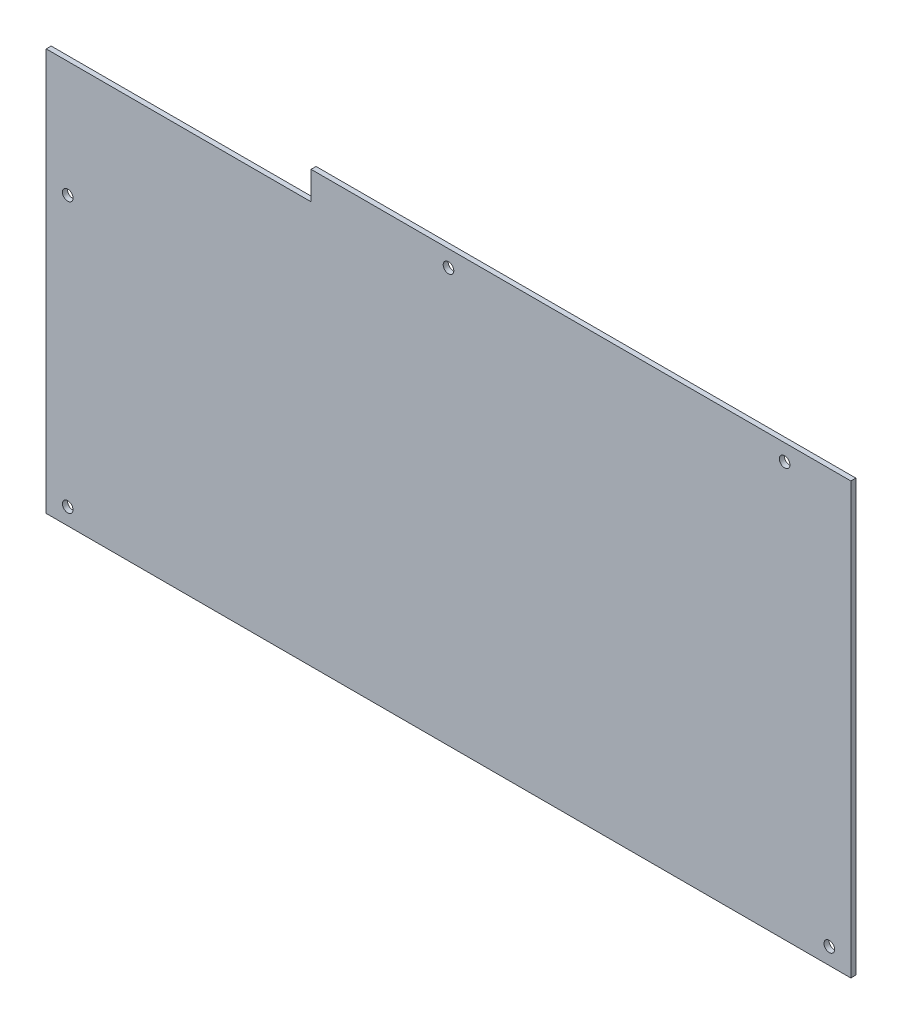
ISO-10303-21;
HEADER;
FILE_DESCRIPTION(('STEP AP214'),'2;1');
FILE_NAME('part.step','',(''),(''),'','','');
FILE_SCHEMA(('AUTOMOTIVE_DESIGN { 1 0 10303 214 1 1 1 1 }'));
ENDSEC;
DATA;
#1=APPLICATION_CONTEXT('core data for automotive mechanical design processes');
#2=APPLICATION_PROTOCOL_DEFINITION('international standard','automotive_design',2000,#1);
#3=PRODUCT_CONTEXT('',#1,'mechanical');
#4=PRODUCT('Part','Part','',(#3));
#5=PRODUCT_RELATED_PRODUCT_CATEGORY('part','',(#4));
#6=PRODUCT_DEFINITION_FORMATION('','',#4);
#7=PRODUCT_DEFINITION_CONTEXT('part definition',#1,'design');
#8=PRODUCT_DEFINITION('design','',#6,#7);
#9=PRODUCT_DEFINITION_SHAPE('','',#8);
#10=(LENGTH_UNIT() NAMED_UNIT(*) SI_UNIT(.MILLI.,.METRE.));
#11=(NAMED_UNIT(*) PLANE_ANGLE_UNIT() SI_UNIT($,.RADIAN.));
#12=(NAMED_UNIT(*) SI_UNIT($,.STERADIAN.) SOLID_ANGLE_UNIT());
#13=UNCERTAINTY_MEASURE_WITH_UNIT(LENGTH_MEASURE(1.E-05),#10,'distance_accuracy_value','');
#14=(GEOMETRIC_REPRESENTATION_CONTEXT(3) GLOBAL_UNCERTAINTY_ASSIGNED_CONTEXT((#13)) GLOBAL_UNIT_ASSIGNED_CONTEXT((#10,
#11,#12)) REPRESENTATION_CONTEXT('',''));
#15=CARTESIAN_POINT('',(0.,0.,0.));
#16=DIRECTION('',(0.,0.,1.));
#17=DIRECTION('',(1.,0.,0.));
#18=AXIS2_PLACEMENT_3D('',#15,#16,#17);
#19=CARTESIAN_POINT('',(-241.5,1.49999999999999,1.5));
#20=DIRECTION('',(1.,0.,0.));
#21=DIRECTION('',(0.,1.,0.));
#22=AXIS2_PLACEMENT_3D('',#19,#20,#21);
#23=PLANE('',#22);
#24=DIRECTION('',(0.,-1.,0.));
#25=VECTOR('',#24,1.);
#26=CARTESIAN_POINT('',(-241.5,1.49999999999999,0.));
#27=LINE('',#26,#25);
#28=CARTESIAN_POINT('',(-241.5,1.49999999999999,0.));
#29=VERTEX_POINT('',#28);
#30=CARTESIAN_POINT('',(-241.5,-120.,0.));
#31=VERTEX_POINT('',#30);
#32=EDGE_CURVE('E116',#29,#31,#27,.T.);
#33=ORIENTED_EDGE('',*,*,#32,.T.);
#34=DIRECTION('',(0.,0.,-1.));
#35=VECTOR('',#34,1.);
#36=CARTESIAN_POINT('',(-241.5,-120.,1.5));
#37=LINE('',#36,#35);
#38=CARTESIAN_POINT('',(-241.5,-120.,1.5));
#39=VERTEX_POINT('',#38);
#40=EDGE_CURVE('E11',#39,#31,#37,.T.);
#41=ORIENTED_EDGE('',*,*,#40,.F.);
#42=DIRECTION('',(0.,-1.,0.));
#43=VECTOR('',#42,1.);
#44=CARTESIAN_POINT('',(-241.5,1.49999999999999,1.5));
#45=LINE('',#44,#43);
#46=CARTESIAN_POINT('',(-241.5,1.49999999999999,1.5));
#47=VERTEX_POINT('',#46);
#48=EDGE_CURVE('E127',#47,#39,#45,.T.);
#49=ORIENTED_EDGE('',*,*,#48,.F.);
#50=DIRECTION('',(0.,0.,-1.));
#51=VECTOR('',#50,1.);
#52=CARTESIAN_POINT('',(-241.5,1.49999999999999,1.5));
#53=LINE('',#52,#51);
#54=EDGE_CURVE('E112',#47,#29,#53,.T.);
#55=ORIENTED_EDGE('',*,*,#54,.T.);
#56=EDGE_LOOP('',(#33,#41,#49,#55));
#57=FACE_BOUND('',#56,.T.);
#58=ADVANCED_FACE('F32',(#57),#23,.F.);
#59=CARTESIAN_POINT('',(-241.5,-120.,1.5));
#60=DIRECTION('',(0.,1.,0.));
#61=DIRECTION('',(0.,0.,1.));
#62=AXIS2_PLACEMENT_3D('',#59,#60,#61);
#63=PLANE('',#62);
#64=DIRECTION('',(1.,0.,0.));
#65=VECTOR('',#64,1.);
#66=CARTESIAN_POINT('',(-241.5,-120.,0.));
#67=LINE('',#66,#65);
#68=CARTESIAN_POINT('',(1.50000000000002,-120.,0.));
#69=VERTEX_POINT('',#68);
#70=EDGE_CURVE('E119',#31,#69,#67,.T.);
#71=ORIENTED_EDGE('',*,*,#70,.T.);
#72=DIRECTION('',(0.,0.,-1.));
#73=VECTOR('',#72,1.);
#74=CARTESIAN_POINT('',(1.50000000000002,-120.,1.5));
#75=LINE('',#74,#73);
#76=CARTESIAN_POINT('',(1.50000000000002,-120.,1.5));
#77=VERTEX_POINT('',#76);
#78=EDGE_CURVE('E40',#77,#69,#75,.T.);
#79=ORIENTED_EDGE('',*,*,#78,.F.);
#80=DIRECTION('',(1.,0.,0.));
#81=VECTOR('',#80,1.);
#82=CARTESIAN_POINT('',(-241.5,-120.,1.5));
#83=LINE('',#82,#81);
#84=EDGE_CURVE('E85',#39,#77,#83,.T.);
#85=ORIENTED_EDGE('',*,*,#84,.F.);
#86=ORIENTED_EDGE('',*,*,#40,.T.);
#87=EDGE_LOOP('',(#71,#79,#85,#86));
#88=FACE_BOUND('',#87,.T.);
#89=ADVANCED_FACE('F152',(#88),#63,.F.);
#90=CARTESIAN_POINT('',(1.50000000000002,-120.,1.5));
#91=DIRECTION('',(-1.,0.,0.));
#92=DIRECTION('',(0.,0.,1.));
#93=AXIS2_PLACEMENT_3D('',#90,#91,#92);
#94=PLANE('',#93);
#95=DIRECTION('',(0.,1.,0.));
#96=VECTOR('',#95,1.);
#97=CARTESIAN_POINT('',(1.50000000000002,-120.,0.));
#98=LINE('',#97,#96);
#99=CARTESIAN_POINT('',(1.50000000000002,10.,0.));
#100=VERTEX_POINT('',#99);
#101=EDGE_CURVE('E122',#69,#100,#98,.T.);
#102=ORIENTED_EDGE('',*,*,#101,.T.);
#103=DIRECTION('',(0.,0.,-1.));
#104=VECTOR('',#103,1.);
#105=CARTESIAN_POINT('',(1.50000000000002,10.,1.5));
#106=LINE('',#105,#104);
#107=CARTESIAN_POINT('',(1.50000000000002,10.,1.5));
#108=VERTEX_POINT('',#107);
#109=EDGE_CURVE('E107',#108,#100,#106,.T.);
#110=ORIENTED_EDGE('',*,*,#109,.F.);
#111=DIRECTION('',(0.,1.,0.));
#112=VECTOR('',#111,1.);
#113=CARTESIAN_POINT('',(1.50000000000002,-120.,1.5));
#114=LINE('',#113,#112);
#115=EDGE_CURVE('E98',#77,#108,#114,.T.);
#116=ORIENTED_EDGE('',*,*,#115,.F.);
#117=ORIENTED_EDGE('',*,*,#78,.T.);
#118=EDGE_LOOP('',(#102,#110,#116,#117));
#119=FACE_BOUND('',#118,.T.);
#120=ADVANCED_FACE('F133',(#119),#94,.F.);
#121=CARTESIAN_POINT('',(1.50000000000002,10.,1.5));
#122=DIRECTION('',(0.,-1.,0.));
#123=DIRECTION('',(1.,0.,0.));
#124=AXIS2_PLACEMENT_3D('',#121,#122,#123);
#125=PLANE('',#124);
#126=DIRECTION('',(-1.,0.,0.));
#127=VECTOR('',#126,1.);
#128=CARTESIAN_POINT('',(1.50000000000002,10.,0.));
#129=LINE('',#128,#127);
#130=CARTESIAN_POINT('',(-161.500000000001,10.,0.));
#131=VERTEX_POINT('',#130);
#132=EDGE_CURVE('E106',#100,#131,#129,.T.);
#133=ORIENTED_EDGE('',*,*,#132,.T.);
#134=DIRECTION('',(0.,0.,-1.));
#135=VECTOR('',#134,1.);
#136=CARTESIAN_POINT('',(-161.500000000001,10.,1.5));
#137=LINE('',#136,#135);
#138=CARTESIAN_POINT('',(-161.500000000001,10.,1.5));
#139=VERTEX_POINT('',#138);
#140=EDGE_CURVE('E103',#139,#131,#137,.T.);
#141=ORIENTED_EDGE('',*,*,#140,.F.);
#142=DIRECTION('',(-1.,0.,0.));
#143=VECTOR('',#142,1.);
#144=CARTESIAN_POINT('',(1.50000000000002,10.,1.5));
#145=LINE('',#144,#143);
#146=EDGE_CURVE('E92',#108,#139,#145,.T.);
#147=ORIENTED_EDGE('',*,*,#146,.F.);
#148=ORIENTED_EDGE('',*,*,#109,.T.);
#149=EDGE_LOOP('',(#133,#141,#147,#148));
#150=FACE_BOUND('',#149,.T.);
#151=ADVANCED_FACE('F104',(#150),#125,.F.);
#152=CARTESIAN_POINT('',(-161.500000000001,10.,1.5));
#153=DIRECTION('',(1.,0.,0.));
#154=DIRECTION('',(0.,0.,-1.));
#155=AXIS2_PLACEMENT_3D('',#152,#153,#154);
#156=PLANE('',#155);
#157=DIRECTION('',(0.,-1.,0.));
#158=VECTOR('',#157,1.);
#159=CARTESIAN_POINT('',(-161.500000000001,10.,0.));
#160=LINE('',#159,#158);
#161=CARTESIAN_POINT('',(-161.500000000001,1.49999999999999,0.));
#162=VERTEX_POINT('',#161);
#163=EDGE_CURVE('E71',#131,#162,#160,.T.);
#164=ORIENTED_EDGE('',*,*,#163,.T.);
#165=DIRECTION('',(0.,0.,-1.));
#166=VECTOR('',#165,1.);
#167=CARTESIAN_POINT('',(-161.500000000001,1.49999999999999,1.5));
#168=LINE('',#167,#166);
#169=CARTESIAN_POINT('',(-161.500000000001,1.49999999999999,1.5));
#170=VERTEX_POINT('',#169);
#171=EDGE_CURVE('E108',#170,#162,#168,.T.);
#172=ORIENTED_EDGE('',*,*,#171,.F.);
#173=DIRECTION('',(0.,-1.,0.));
#174=VECTOR('',#173,1.);
#175=CARTESIAN_POINT('',(-161.500000000001,10.,1.5));
#176=LINE('',#175,#174);
#177=EDGE_CURVE('E96',#139,#170,#176,.T.);
#178=ORIENTED_EDGE('',*,*,#177,.F.);
#179=ORIENTED_EDGE('',*,*,#140,.T.);
#180=EDGE_LOOP('',(#164,#172,#178,#179));
#181=FACE_BOUND('',#180,.T.);
#182=ADVANCED_FACE('F110',(#181),#156,.F.);
#183=CARTESIAN_POINT('',(-161.500000000001,1.49999999999999,1.5));
#184=DIRECTION('',(0.,-1.,0.));
#185=DIRECTION('',(1.,0.,0.));
#186=AXIS2_PLACEMENT_3D('',#183,#184,#185);
#187=PLANE('',#186);
#188=DIRECTION('',(-1.,0.,0.));
#189=VECTOR('',#188,1.);
#190=CARTESIAN_POINT('',(-161.500000000001,1.49999999999999,0.));
#191=LINE('',#190,#189);
#192=EDGE_CURVE('E77',#162,#29,#191,.T.);
#193=ORIENTED_EDGE('',*,*,#192,.T.);
#194=ORIENTED_EDGE('',*,*,#54,.F.);
#195=DIRECTION('',(-1.,0.,0.));
#196=VECTOR('',#195,1.);
#197=CARTESIAN_POINT('',(-161.500000000001,1.49999999999999,1.5));
#198=LINE('',#197,#196);
#199=EDGE_CURVE('E48',#170,#47,#198,.T.);
#200=ORIENTED_EDGE('',*,*,#199,.F.);
#201=ORIENTED_EDGE('',*,*,#171,.T.);
#202=EDGE_LOOP('',(#193,#194,#200,#201));
#203=FACE_BOUND('',#202,.T.);
#204=ADVANCED_FACE('F140',(#203),#187,.F.);
#205=CARTESIAN_POINT('',(0.,0.,1.5));
#206=DIRECTION('',(0.,0.,1.));
#207=DIRECTION('',(1.,0.,0.));
#208=AXIS2_PLACEMENT_3D('',#205,#206,#207);
#209=PLANE('',#208);
#210=CARTESIAN_POINT('',(-18.5,5.,1.5));
#211=DIRECTION('',(0.,0.,1.));
#212=DIRECTION('',(1.,0.,0.));
#213=AXIS2_PLACEMENT_3D('',#210,#211,#212);
#214=CIRCLE('',#213,1.6);
#215=CARTESIAN_POINT('',(-16.9,5.,1.5));
#216=VERTEX_POINT('',#215);
#217=EDGE_CURVE('E248',#216,#216,#214,.T.);
#218=ORIENTED_EDGE('',*,*,#217,.F.);
#219=EDGE_LOOP('',(#218));
#220=FACE_BOUND('',#219,.T.);
#221=CARTESIAN_POINT('',(-120.,5.,1.5));
#222=DIRECTION('',(0.,0.,1.));
#223=DIRECTION('',(1.,0.,0.));
#224=AXIS2_PLACEMENT_3D('',#221,#222,#223);
#225=CIRCLE('',#224,1.60000000000001);
#226=CARTESIAN_POINT('',(-118.4,5.,1.5));
#227=VERTEX_POINT('',#226);
#228=EDGE_CURVE('E250',#227,#227,#225,.T.);
#229=ORIENTED_EDGE('',*,*,#228,.F.);
#230=EDGE_LOOP('',(#229));
#231=FACE_BOUND('',#230,.T.);
#232=CARTESIAN_POINT('',(-5.,-115.,1.5));
#233=DIRECTION('',(0.,0.,1.));
#234=DIRECTION('',(1.,0.,0.));
#235=AXIS2_PLACEMENT_3D('',#232,#233,#234);
#236=CIRCLE('',#235,1.6);
#237=CARTESIAN_POINT('',(-3.4,-115.,1.5));
#238=VERTEX_POINT('',#237);
#239=EDGE_CURVE('E256',#238,#238,#236,.T.);
#240=ORIENTED_EDGE('',*,*,#239,.F.);
#241=EDGE_LOOP('',(#240));
#242=FACE_BOUND('',#241,.T.);
#243=CARTESIAN_POINT('',(-235.,-115.,1.5));
#244=DIRECTION('',(0.,0.,1.));
#245=DIRECTION('',(1.,0.,0.));
#246=AXIS2_PLACEMENT_3D('',#243,#244,#245);
#247=CIRCLE('',#246,1.59999999999999);
#248=CARTESIAN_POINT('',(-233.4,-115.,1.5));
#249=VERTEX_POINT('',#248);
#250=EDGE_CURVE('E262',#249,#249,#247,.T.);
#251=ORIENTED_EDGE('',*,*,#250,.F.);
#252=EDGE_LOOP('',(#251));
#253=FACE_BOUND('',#252,.T.);
#254=CARTESIAN_POINT('',(-235.,-33.5000000000002,1.5));
#255=DIRECTION('',(0.,0.,1.));
#256=DIRECTION('',(1.,0.,0.));
#257=AXIS2_PLACEMENT_3D('',#254,#255,#256);
#258=CIRCLE('',#257,1.59999999999999);
#259=CARTESIAN_POINT('',(-233.4,-33.5000000000002,1.5));
#260=VERTEX_POINT('',#259);
#261=EDGE_CURVE('E268',#260,#260,#258,.T.);
#262=ORIENTED_EDGE('',*,*,#261,.F.);
#263=EDGE_LOOP('',(#262));
#264=FACE_BOUND('',#263,.T.);
#265=ORIENTED_EDGE('',*,*,#48,.T.);
#266=ORIENTED_EDGE('',*,*,#84,.T.);
#267=ORIENTED_EDGE('',*,*,#115,.T.);
#268=ORIENTED_EDGE('',*,*,#146,.T.);
#269=ORIENTED_EDGE('',*,*,#177,.T.);
#270=ORIENTED_EDGE('',*,*,#199,.T.);
#271=EDGE_LOOP('',(#265,#266,#267,#268,#269,#270));
#272=FACE_BOUND('',#271,.T.);
#273=ADVANCED_FACE('F94',(#220,#231,#242,#253,#264,#272),#209,.T.);
#274=CARTESIAN_POINT('',(0.,0.,0.));
#275=DIRECTION('',(0.,0.,1.));
#276=DIRECTION('',(1.,0.,0.));
#277=AXIS2_PLACEMENT_3D('',#274,#275,#276);
#278=PLANE('',#277);
#279=CARTESIAN_POINT('',(-18.5,5.,0.));
#280=DIRECTION('',(0.,0.,1.));
#281=DIRECTION('',(1.,0.,0.));
#282=AXIS2_PLACEMENT_3D('',#279,#280,#281);
#283=CIRCLE('',#282,1.6);
#284=CARTESIAN_POINT('',(-16.9,5.,0.));
#285=VERTEX_POINT('',#284);
#286=EDGE_CURVE('E245',#285,#285,#283,.T.);
#287=ORIENTED_EDGE('',*,*,#286,.T.);
#288=EDGE_LOOP('',(#287));
#289=FACE_BOUND('',#288,.T.);
#290=CARTESIAN_POINT('',(-120.,5.,0.));
#291=DIRECTION('',(0.,0.,1.));
#292=DIRECTION('',(1.,0.,0.));
#293=AXIS2_PLACEMENT_3D('',#290,#291,#292);
#294=CIRCLE('',#293,1.60000000000001);
#295=CARTESIAN_POINT('',(-118.4,5.,0.));
#296=VERTEX_POINT('',#295);
#297=EDGE_CURVE('E253',#296,#296,#294,.T.);
#298=ORIENTED_EDGE('',*,*,#297,.T.);
#299=EDGE_LOOP('',(#298));
#300=FACE_BOUND('',#299,.T.);
#301=CARTESIAN_POINT('',(-5.,-115.,0.));
#302=DIRECTION('',(0.,0.,1.));
#303=DIRECTION('',(1.,0.,0.));
#304=AXIS2_PLACEMENT_3D('',#301,#302,#303);
#305=CIRCLE('',#304,1.6);
#306=CARTESIAN_POINT('',(-3.4,-115.,0.));
#307=VERTEX_POINT('',#306);
#308=EDGE_CURVE('E259',#307,#307,#305,.T.);
#309=ORIENTED_EDGE('',*,*,#308,.T.);
#310=EDGE_LOOP('',(#309));
#311=FACE_BOUND('',#310,.T.);
#312=CARTESIAN_POINT('',(-235.,-115.,0.));
#313=DIRECTION('',(0.,0.,1.));
#314=DIRECTION('',(1.,0.,0.));
#315=AXIS2_PLACEMENT_3D('',#312,#313,#314);
#316=CIRCLE('',#315,1.59999999999999);
#317=CARTESIAN_POINT('',(-233.4,-115.,0.));
#318=VERTEX_POINT('',#317);
#319=EDGE_CURVE('E265',#318,#318,#316,.T.);
#320=ORIENTED_EDGE('',*,*,#319,.T.);
#321=EDGE_LOOP('',(#320));
#322=FACE_BOUND('',#321,.T.);
#323=CARTESIAN_POINT('',(-235.,-33.5000000000002,0.));
#324=DIRECTION('',(0.,0.,1.));
#325=DIRECTION('',(1.,0.,0.));
#326=AXIS2_PLACEMENT_3D('',#323,#324,#325);
#327=CIRCLE('',#326,1.59999999999999);
#328=CARTESIAN_POINT('',(-233.4,-33.5000000000002,0.));
#329=VERTEX_POINT('',#328);
#330=EDGE_CURVE('E120',#329,#329,#327,.T.);
#331=ORIENTED_EDGE('',*,*,#330,.T.);
#332=EDGE_LOOP('',(#331));
#333=FACE_BOUND('',#332,.T.);
#334=ORIENTED_EDGE('',*,*,#32,.F.);
#335=ORIENTED_EDGE('',*,*,#192,.F.);
#336=ORIENTED_EDGE('',*,*,#163,.F.);
#337=ORIENTED_EDGE('',*,*,#132,.F.);
#338=ORIENTED_EDGE('',*,*,#101,.F.);
#339=ORIENTED_EDGE('',*,*,#70,.F.);
#340=EDGE_LOOP('',(#334,#335,#336,#337,#338,#339));
#341=FACE_BOUND('',#340,.T.);
#342=ADVANCED_FACE('F136',(#289,#300,#311,#322,#333,#341),#278,.F.);
#343=CARTESIAN_POINT('',(-235.,-33.5000000000002,0.));
#344=DIRECTION('',(0.,0.,1.));
#345=DIRECTION('',(1.,0.,0.));
#346=AXIS2_PLACEMENT_3D('',#343,#344,#345);
#347=CYLINDRICAL_SURFACE('',#346,1.59999999999999);
#348=ORIENTED_EDGE('',*,*,#330,.F.);
#349=EDGE_LOOP('',(#348));
#350=FACE_BOUND('',#349,.T.);
#351=ORIENTED_EDGE('',*,*,#261,.T.);
#352=EDGE_LOOP('',(#351));
#353=FACE_BOUND('',#352,.T.);
#354=ADVANCED_FACE('F189',(#350,#353),#347,.F.);
#355=CARTESIAN_POINT('',(-235.,-115.,0.));
#356=DIRECTION('',(0.,0.,1.));
#357=DIRECTION('',(1.,0.,0.));
#358=AXIS2_PLACEMENT_3D('',#355,#356,#357);
#359=CYLINDRICAL_SURFACE('',#358,1.59999999999999);
#360=ORIENTED_EDGE('',*,*,#319,.F.);
#361=EDGE_LOOP('',(#360));
#362=FACE_BOUND('',#361,.T.);
#363=ORIENTED_EDGE('',*,*,#250,.T.);
#364=EDGE_LOOP('',(#363));
#365=FACE_BOUND('',#364,.T.);
#366=ADVANCED_FACE('F198',(#362,#365),#359,.F.);
#367=CARTESIAN_POINT('',(-5.,-115.,0.));
#368=DIRECTION('',(0.,0.,1.));
#369=DIRECTION('',(1.,0.,0.));
#370=AXIS2_PLACEMENT_3D('',#367,#368,#369);
#371=CYLINDRICAL_SURFACE('',#370,1.6);
#372=ORIENTED_EDGE('',*,*,#308,.F.);
#373=EDGE_LOOP('',(#372));
#374=FACE_BOUND('',#373,.T.);
#375=ORIENTED_EDGE('',*,*,#239,.T.);
#376=EDGE_LOOP('',(#375));
#377=FACE_BOUND('',#376,.T.);
#378=ADVANCED_FACE('F208',(#374,#377),#371,.F.);
#379=CARTESIAN_POINT('',(-120.,5.,0.));
#380=DIRECTION('',(0.,0.,1.));
#381=DIRECTION('',(1.,0.,0.));
#382=AXIS2_PLACEMENT_3D('',#379,#380,#381);
#383=CYLINDRICAL_SURFACE('',#382,1.60000000000001);
#384=ORIENTED_EDGE('',*,*,#297,.F.);
#385=EDGE_LOOP('',(#384));
#386=FACE_BOUND('',#385,.T.);
#387=ORIENTED_EDGE('',*,*,#228,.T.);
#388=EDGE_LOOP('',(#387));
#389=FACE_BOUND('',#388,.T.);
#390=ADVANCED_FACE('F218',(#386,#389),#383,.F.);
#391=CARTESIAN_POINT('',(-18.5,5.,0.));
#392=DIRECTION('',(0.,0.,1.));
#393=DIRECTION('',(1.,0.,0.));
#394=AXIS2_PLACEMENT_3D('',#391,#392,#393);
#395=CYLINDRICAL_SURFACE('',#394,1.6);
#396=ORIENTED_EDGE('',*,*,#286,.F.);
#397=EDGE_LOOP('',(#396));
#398=FACE_BOUND('',#397,.T.);
#399=ORIENTED_EDGE('',*,*,#217,.T.);
#400=EDGE_LOOP('',(#399));
#401=FACE_BOUND('',#400,.T.);
#402=ADVANCED_FACE('F228',(#398,#401),#395,.F.);
#403=CLOSED_SHELL('',(#58,#89,#120,#151,#182,#204,#273,#342,#354,#366,#378,#390,#402));
#404=MANIFOLD_SOLID_BREP('B2',#403);
#405=ADVANCED_BREP_SHAPE_REPRESENTATION('',(#18,#404),#14);
#406=SHAPE_DEFINITION_REPRESENTATION(#9,#405);
ENDSEC;
END-ISO-10303-21;
